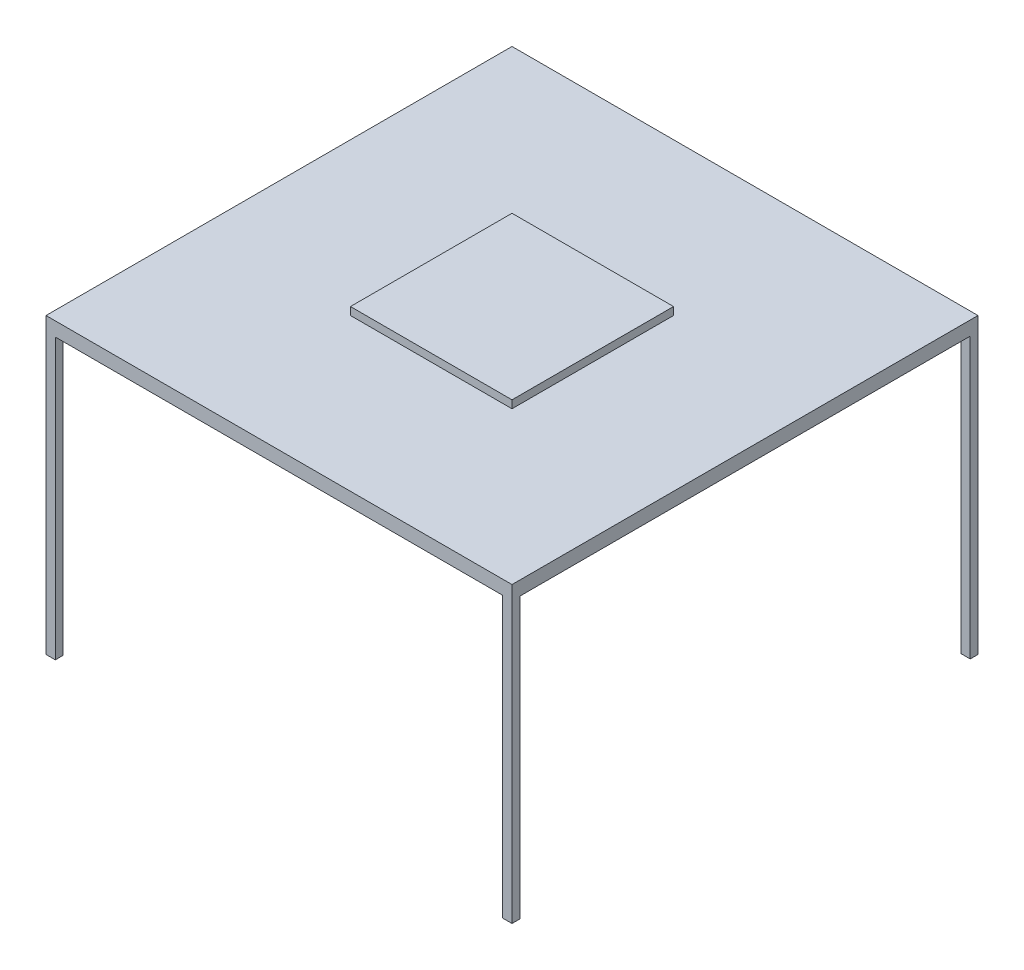
ISO-10303-21;
HEADER;
FILE_DESCRIPTION(('STEP AP214'),'2;1');
FILE_NAME('part.step','',(''),(''),'','','');
FILE_SCHEMA(('AUTOMOTIVE_DESIGN { 1 0 10303 214 1 1 1 1 }'));
ENDSEC;
DATA;
#1=APPLICATION_CONTEXT('core data for automotive mechanical design processes');
#2=APPLICATION_PROTOCOL_DEFINITION('international standard','automotive_design',2000,#1);
#3=PRODUCT_CONTEXT('',#1,'mechanical');
#4=PRODUCT('Part','Part','',(#3));
#5=PRODUCT_RELATED_PRODUCT_CATEGORY('part','',(#4));
#6=PRODUCT_DEFINITION_FORMATION('','',#4);
#7=PRODUCT_DEFINITION_CONTEXT('part definition',#1,'design');
#8=PRODUCT_DEFINITION('design','',#6,#7);
#9=PRODUCT_DEFINITION_SHAPE('','',#8);
#10=(LENGTH_UNIT() NAMED_UNIT(*) SI_UNIT(.MILLI.,.METRE.));
#11=(NAMED_UNIT(*) PLANE_ANGLE_UNIT() SI_UNIT($,.RADIAN.));
#12=(NAMED_UNIT(*) SI_UNIT($,.STERADIAN.) SOLID_ANGLE_UNIT());
#13=UNCERTAINTY_MEASURE_WITH_UNIT(LENGTH_MEASURE(1.E-05),#10,'distance_accuracy_value','');
#14=(GEOMETRIC_REPRESENTATION_CONTEXT(3) GLOBAL_UNCERTAINTY_ASSIGNED_CONTEXT((#13)) GLOBAL_UNIT_ASSIGNED_CONTEXT((#10,
#11,#12)) REPRESENTATION_CONTEXT('',''));
#15=CARTESIAN_POINT('',(0.,0.,0.));
#16=DIRECTION('',(0.,0.,1.));
#17=DIRECTION('',(1.,0.,0.));
#18=AXIS2_PLACEMENT_3D('',#15,#16,#17);
#19=CARTESIAN_POINT('',(0.,-45.,0.));
#20=DIRECTION('',(0.,1.,0.));
#21=DIRECTION('',(0.,0.,1.));
#22=AXIS2_PLACEMENT_3D('',#19,#20,#21);
#23=PLANE('',#22);
#24=DIRECTION('',(0.,0.,1.));
#25=VECTOR('',#24,1.);
#26=CARTESIAN_POINT('',(-725.,-45.,-720.));
#27=LINE('',#26,#25);
#28=CARTESIAN_POINT('',(-725.,-45.,-750.));
#29=VERTEX_POINT('',#28);
#30=CARTESIAN_POINT('',(-725.,-45.,-720.));
#31=VERTEX_POINT('',#30);
#32=EDGE_CURVE('E196',#29,#31,#27,.T.);
#33=ORIENTED_EDGE('',*,*,#32,.F.);
#34=DIRECTION('',(1.,0.,0.));
#35=VECTOR('',#34,1.);
#36=CARTESIAN_POINT('',(750.,-45.,-750.));
#37=LINE('',#36,#35);
#38=CARTESIAN_POINT('',(720.,-45.,-750.));
#39=VERTEX_POINT('',#38);
#40=EDGE_CURVE('E278',#29,#39,#37,.T.);
#41=ORIENTED_EDGE('',*,*,#40,.T.);
#42=DIRECTION('',(0.,0.,-1.));
#43=VECTOR('',#42,1.);
#44=CARTESIAN_POINT('',(720.,-45.,-750.));
#45=LINE('',#44,#43);
#46=CARTESIAN_POINT('',(720.,-45.,-725.));
#47=VERTEX_POINT('',#46);
#48=EDGE_CURVE('E200',#47,#39,#45,.T.);
#49=ORIENTED_EDGE('',*,*,#48,.F.);
#50=DIRECTION('',(-1.,0.,0.));
#51=VECTOR('',#50,1.);
#52=CARTESIAN_POINT('',(720.,-45.,-725.));
#53=LINE('',#52,#51);
#54=CARTESIAN_POINT('',(750.,-45.,-725.));
#55=VERTEX_POINT('',#54);
#56=EDGE_CURVE('E197',#55,#47,#53,.T.);
#57=ORIENTED_EDGE('',*,*,#56,.F.);
#58=DIRECTION('',(0.,0.,1.));
#59=VECTOR('',#58,1.);
#60=CARTESIAN_POINT('',(750.,-45.,750.));
#61=LINE('',#60,#59);
#62=CARTESIAN_POINT('',(750.,-45.,725.));
#63=VERTEX_POINT('',#62);
#64=EDGE_CURVE('E281',#55,#63,#61,.T.);
#65=ORIENTED_EDGE('',*,*,#64,.T.);
#66=DIRECTION('',(1.,0.,0.));
#67=VECTOR('',#66,1.);
#68=CARTESIAN_POINT('',(720.,-45.,725.));
#69=LINE('',#68,#67);
#70=CARTESIAN_POINT('',(720.,-45.,725.));
#71=VERTEX_POINT('',#70);
#72=EDGE_CURVE('E257',#71,#63,#69,.T.);
#73=ORIENTED_EDGE('',*,*,#72,.F.);
#74=DIRECTION('',(0.,0.,-1.));
#75=VECTOR('',#74,1.);
#76=CARTESIAN_POINT('',(720.,-45.,750.));
#77=LINE('',#76,#75);
#78=CARTESIAN_POINT('',(720.,-45.,750.));
#79=VERTEX_POINT('',#78);
#80=EDGE_CURVE('E252',#79,#71,#77,.T.);
#81=ORIENTED_EDGE('',*,*,#80,.F.);
#82=DIRECTION('',(-1.,0.,0.));
#83=VECTOR('',#82,1.);
#84=CARTESIAN_POINT('',(750.,-45.,750.));
#85=LINE('',#84,#83);
#86=CARTESIAN_POINT('',(-720.,-45.,750.));
#87=VERTEX_POINT('',#86);
#88=EDGE_CURVE('E283',#79,#87,#85,.T.);
#89=ORIENTED_EDGE('',*,*,#88,.T.);
#90=DIRECTION('',(0.,0.,1.));
#91=VECTOR('',#90,1.);
#92=CARTESIAN_POINT('',(-720.,-45.,750.));
#93=LINE('',#92,#91);
#94=CARTESIAN_POINT('',(-720.,-45.,725.));
#95=VERTEX_POINT('',#94);
#96=EDGE_CURVE('E232',#95,#87,#93,.T.);
#97=ORIENTED_EDGE('',*,*,#96,.F.);
#98=DIRECTION('',(1.,0.,0.));
#99=VECTOR('',#98,1.);
#100=CARTESIAN_POINT('',(-720.,-45.,725.));
#101=LINE('',#100,#99);
#102=CARTESIAN_POINT('',(-750.,-45.,725.));
#103=VERTEX_POINT('',#102);
#104=EDGE_CURVE('E227',#103,#95,#101,.T.);
#105=ORIENTED_EDGE('',*,*,#104,.F.);
#106=DIRECTION('',(0.,0.,-1.));
#107=VECTOR('',#106,1.);
#108=CARTESIAN_POINT('',(-750.,-45.,750.));
#109=LINE('',#108,#107);
#110=CARTESIAN_POINT('',(-750.,-45.,-720.));
#111=VERTEX_POINT('',#110);
#112=EDGE_CURVE('E58',#103,#111,#109,.T.);
#113=ORIENTED_EDGE('',*,*,#112,.T.);
#114=DIRECTION('',(-1.,0.,0.));
#115=VECTOR('',#114,1.);
#116=CARTESIAN_POINT('',(-750.,-45.,-720.));
#117=LINE('',#116,#115);
#118=EDGE_CURVE('E53',#31,#111,#117,.T.);
#119=ORIENTED_EDGE('',*,*,#118,.F.);
#120=EDGE_LOOP('',(#33,#41,#49,#57,#65,#73,#81,#89,#97,#105,#113,#119));
#121=FACE_BOUND('',#120,.T.);
#122=ADVANCED_FACE('F38',(#121),#23,.F.);
#123=CARTESIAN_POINT('',(0.,25.,260.));
#124=DIRECTION('',(0.,0.,-1.));
#125=DIRECTION('',(-1.,0.,0.));
#126=AXIS2_PLACEMENT_3D('',#123,#124,#125);
#127=PLANE('',#126);
#128=DIRECTION('',(1.,0.,0.));
#129=VECTOR('',#128,1.);
#130=CARTESIAN_POINT('',(0.,0.,260.));
#131=LINE('',#130,#129);
#132=CARTESIAN_POINT('',(-260.,0.,260.));
#133=VERTEX_POINT('',#132);
#134=CARTESIAN_POINT('',(260.,0.,260.));
#135=VERTEX_POINT('',#134);
#136=EDGE_CURVE('E304',#133,#135,#131,.T.);
#137=ORIENTED_EDGE('',*,*,#136,.T.);
#138=DIRECTION('',(0.,-1.,0.));
#139=VECTOR('',#138,1.);
#140=CARTESIAN_POINT('',(260.,25.,260.));
#141=LINE('',#140,#139);
#142=CARTESIAN_POINT('',(260.,25.,260.));
#143=VERTEX_POINT('',#142);
#144=EDGE_CURVE('E11',#143,#135,#141,.T.);
#145=ORIENTED_EDGE('',*,*,#144,.F.);
#146=DIRECTION('',(1.,0.,0.));
#147=VECTOR('',#146,1.);
#148=CARTESIAN_POINT('',(0.,25.,260.));
#149=LINE('',#148,#147);
#150=CARTESIAN_POINT('',(-260.,25.,260.));
#151=VERTEX_POINT('',#150);
#152=EDGE_CURVE('E305',#151,#143,#149,.T.);
#153=ORIENTED_EDGE('',*,*,#152,.F.);
#154=DIRECTION('',(0.,-1.,0.));
#155=VECTOR('',#154,1.);
#156=CARTESIAN_POINT('',(-260.,25.,260.));
#157=LINE('',#156,#155);
#158=EDGE_CURVE('E317',#151,#133,#157,.T.);
#159=ORIENTED_EDGE('',*,*,#158,.T.);
#160=EDGE_LOOP('',(#137,#145,#153,#159));
#161=FACE_BOUND('',#160,.T.);
#162=ADVANCED_FACE('F40',(#161),#127,.F.);
#163=CARTESIAN_POINT('',(260.,25.,0.));
#164=DIRECTION('',(-1.,0.,0.));
#165=DIRECTION('',(0.,0.,1.));
#166=AXIS2_PLACEMENT_3D('',#163,#164,#165);
#167=PLANE('',#166);
#168=DIRECTION('',(0.,0.,-1.));
#169=VECTOR('',#168,1.);
#170=CARTESIAN_POINT('',(260.,0.,0.));
#171=LINE('',#170,#169);
#172=CARTESIAN_POINT('',(260.,0.,-260.));
#173=VERTEX_POINT('',#172);
#174=EDGE_CURVE('E320',#135,#173,#171,.T.);
#175=ORIENTED_EDGE('',*,*,#174,.T.);
#176=DIRECTION('',(0.,-1.,0.));
#177=VECTOR('',#176,1.);
#178=CARTESIAN_POINT('',(260.,25.,-260.));
#179=LINE('',#178,#177);
#180=CARTESIAN_POINT('',(260.,25.,-260.));
#181=VERTEX_POINT('',#180);
#182=EDGE_CURVE('E46',#181,#173,#179,.T.);
#183=ORIENTED_EDGE('',*,*,#182,.F.);
#184=DIRECTION('',(0.,0.,-1.));
#185=VECTOR('',#184,1.);
#186=CARTESIAN_POINT('',(260.,25.,0.));
#187=LINE('',#186,#185);
#188=EDGE_CURVE('E308',#143,#181,#187,.T.);
#189=ORIENTED_EDGE('',*,*,#188,.F.);
#190=ORIENTED_EDGE('',*,*,#144,.T.);
#191=EDGE_LOOP('',(#175,#183,#189,#190));
#192=FACE_BOUND('',#191,.T.);
#193=ADVANCED_FACE('F337',(#192),#167,.F.);
#194=CARTESIAN_POINT('',(0.,25.,-260.));
#195=DIRECTION('',(0.,0.,-1.));
#196=DIRECTION('',(-1.,0.,0.));
#197=AXIS2_PLACEMENT_3D('',#194,#195,#196);
#198=PLANE('',#197);
#199=DIRECTION('',(1.,0.,0.));
#200=VECTOR('',#199,1.);
#201=CARTESIAN_POINT('',(0.,0.,-260.));
#202=LINE('',#201,#200);
#203=CARTESIAN_POINT('',(-260.,0.,-260.));
#204=VERTEX_POINT('',#203);
#205=EDGE_CURVE('E323',#204,#173,#202,.T.);
#206=ORIENTED_EDGE('',*,*,#205,.F.);
#207=DIRECTION('',(0.,-1.,0.));
#208=VECTOR('',#207,1.);
#209=CARTESIAN_POINT('',(-260.,25.,-260.));
#210=LINE('',#209,#208);
#211=CARTESIAN_POINT('',(-260.,25.,-260.));
#212=VERTEX_POINT('',#211);
#213=EDGE_CURVE('E328',#212,#204,#210,.T.);
#214=ORIENTED_EDGE('',*,*,#213,.F.);
#215=DIRECTION('',(1.,0.,0.));
#216=VECTOR('',#215,1.);
#217=CARTESIAN_POINT('',(0.,25.,-260.));
#218=LINE('',#217,#216);
#219=EDGE_CURVE('E311',#212,#181,#218,.T.);
#220=ORIENTED_EDGE('',*,*,#219,.T.);
#221=ORIENTED_EDGE('',*,*,#182,.T.);
#222=EDGE_LOOP('',(#206,#214,#220,#221));
#223=FACE_BOUND('',#222,.T.);
#224=ADVANCED_FACE('F334',(#223),#198,.T.);
#225=CARTESIAN_POINT('',(-260.,25.,0.));
#226=DIRECTION('',(-1.,0.,0.));
#227=DIRECTION('',(0.,0.,1.));
#228=AXIS2_PLACEMENT_3D('',#225,#226,#227);
#229=PLANE('',#228);
#230=DIRECTION('',(0.,0.,-1.));
#231=VECTOR('',#230,1.);
#232=CARTESIAN_POINT('',(-260.,0.,0.));
#233=LINE('',#232,#231);
#234=EDGE_CURVE('E309',#133,#204,#233,.T.);
#235=ORIENTED_EDGE('',*,*,#234,.F.);
#236=ORIENTED_EDGE('',*,*,#158,.F.);
#237=DIRECTION('',(0.,0.,-1.));
#238=VECTOR('',#237,1.);
#239=CARTESIAN_POINT('',(-260.,25.,0.));
#240=LINE('',#239,#238);
#241=EDGE_CURVE('E314',#151,#212,#240,.T.);
#242=ORIENTED_EDGE('',*,*,#241,.T.);
#243=ORIENTED_EDGE('',*,*,#213,.T.);
#244=EDGE_LOOP('',(#235,#236,#242,#243));
#245=FACE_BOUND('',#244,.T.);
#246=ADVANCED_FACE('F343',(#245),#229,.T.);
#247=CARTESIAN_POINT('',(0.,25.,0.));
#248=DIRECTION('',(0.,1.,0.));
#249=DIRECTION('',(0.,0.,1.));
#250=AXIS2_PLACEMENT_3D('',#247,#248,#249);
#251=PLANE('',#250);
#252=ORIENTED_EDGE('',*,*,#152,.T.);
#253=ORIENTED_EDGE('',*,*,#188,.T.);
#254=ORIENTED_EDGE('',*,*,#219,.F.);
#255=ORIENTED_EDGE('',*,*,#241,.F.);
#256=EDGE_LOOP('',(#252,#253,#254,#255));
#257=FACE_BOUND('',#256,.T.);
#258=ADVANCED_FACE('F346',(#257),#251,.T.);
#259=CARTESIAN_POINT('',(0.,0.,0.));
#260=DIRECTION('',(0.,1.,0.));
#261=DIRECTION('',(0.,0.,1.));
#262=AXIS2_PLACEMENT_3D('',#259,#260,#261);
#263=PLANE('',#262);
#264=DIRECTION('',(0.,0.,-1.));
#265=VECTOR('',#264,1.);
#266=CARTESIAN_POINT('',(-750.,0.,750.));
#267=LINE('',#266,#265);
#268=CARTESIAN_POINT('',(-750.,0.,750.));
#269=VERTEX_POINT('',#268);
#270=CARTESIAN_POINT('',(-750.,0.,-750.));
#271=VERTEX_POINT('',#270);
#272=EDGE_CURVE('E276',#269,#271,#267,.T.);
#273=ORIENTED_EDGE('',*,*,#272,.F.);
#274=DIRECTION('',(-1.,0.,0.));
#275=VECTOR('',#274,1.);
#276=CARTESIAN_POINT('',(750.,0.,750.));
#277=LINE('',#276,#275);
#278=CARTESIAN_POINT('',(750.,0.,750.));
#279=VERTEX_POINT('',#278);
#280=EDGE_CURVE('E279',#279,#269,#277,.T.);
#281=ORIENTED_EDGE('',*,*,#280,.F.);
#282=DIRECTION('',(0.,0.,1.));
#283=VECTOR('',#282,1.);
#284=CARTESIAN_POINT('',(750.,0.,750.));
#285=LINE('',#284,#283);
#286=CARTESIAN_POINT('',(750.,0.,-750.));
#287=VERTEX_POINT('',#286);
#288=EDGE_CURVE('E290',#287,#279,#285,.T.);
#289=ORIENTED_EDGE('',*,*,#288,.F.);
#290=DIRECTION('',(1.,0.,0.));
#291=VECTOR('',#290,1.);
#292=CARTESIAN_POINT('',(750.,0.,-750.));
#293=LINE('',#292,#291);
#294=EDGE_CURVE('E288',#271,#287,#293,.T.);
#295=ORIENTED_EDGE('',*,*,#294,.F.);
#296=EDGE_LOOP('',(#273,#281,#289,#295));
#297=FACE_BOUND('',#296,.T.);
#298=ORIENTED_EDGE('',*,*,#136,.F.);
#299=ORIENTED_EDGE('',*,*,#234,.T.);
#300=ORIENTED_EDGE('',*,*,#205,.T.);
#301=ORIENTED_EDGE('',*,*,#174,.F.);
#302=EDGE_LOOP('',(#298,#299,#300,#301));
#303=FACE_BOUND('',#302,.T.);
#304=ADVANCED_FACE('F340',(#297,#303),#263,.T.);
#305=CARTESIAN_POINT('',(-750.,-45.,750.));
#306=DIRECTION('',(1.,0.,0.));
#307=DIRECTION('',(0.,0.,-1.));
#308=AXIS2_PLACEMENT_3D('',#305,#306,#307);
#309=PLANE('',#308);
#310=ORIENTED_EDGE('',*,*,#272,.T.);
#311=DIRECTION('',(0.,1.,0.));
#312=VECTOR('',#311,1.);
#313=CARTESIAN_POINT('',(-750.,-45.,-750.));
#314=LINE('',#313,#312);
#315=CARTESIAN_POINT('',(-750.,-945.,-750.));
#316=VERTEX_POINT('',#315);
#317=EDGE_CURVE('E301',#316,#271,#314,.T.);
#318=ORIENTED_EDGE('',*,*,#317,.F.);
#319=DIRECTION('',(0.,0.,-1.));
#320=VECTOR('',#319,1.);
#321=CARTESIAN_POINT('',(-750.,-945.,-750.));
#322=LINE('',#321,#320);
#323=CARTESIAN_POINT('',(-750.,-945.,-720.));
#324=VERTEX_POINT('',#323);
#325=EDGE_CURVE('E184',#324,#316,#322,.T.);
#326=ORIENTED_EDGE('',*,*,#325,.F.);
#327=DIRECTION('',(0.,1.,0.));
#328=VECTOR('',#327,1.);
#329=CARTESIAN_POINT('',(-750.,-945.,-720.));
#330=LINE('',#329,#328);
#331=EDGE_CURVE('E180',#324,#111,#330,.T.);
#332=ORIENTED_EDGE('',*,*,#331,.T.);
#333=ORIENTED_EDGE('',*,*,#112,.F.);
#334=DIRECTION('',(0.,1.,0.));
#335=VECTOR('',#334,1.);
#336=CARTESIAN_POINT('',(-750.,-945.,725.));
#337=LINE('',#336,#335);
#338=CARTESIAN_POINT('',(-750.,-945.,725.));
#339=VERTEX_POINT('',#338);
#340=EDGE_CURVE('E239',#339,#103,#337,.T.);
#341=ORIENTED_EDGE('',*,*,#340,.F.);
#342=DIRECTION('',(0.,0.,-1.));
#343=VECTOR('',#342,1.);
#344=CARTESIAN_POINT('',(-750.,-945.,725.));
#345=LINE('',#344,#343);
#346=CARTESIAN_POINT('',(-750.,-945.,750.));
#347=VERTEX_POINT('',#346);
#348=EDGE_CURVE('E237',#347,#339,#345,.T.);
#349=ORIENTED_EDGE('',*,*,#348,.F.);
#350=DIRECTION('',(0.,1.,0.));
#351=VECTOR('',#350,1.);
#352=CARTESIAN_POINT('',(-750.,-45.,750.));
#353=LINE('',#352,#351);
#354=EDGE_CURVE('E285',#347,#269,#353,.T.);
#355=ORIENTED_EDGE('',*,*,#354,.T.);
#356=EDGE_LOOP('',(#310,#318,#326,#332,#333,#341,#349,#355));
#357=FACE_BOUND('',#356,.T.);
#358=ADVANCED_FACE('F363',(#357),#309,.F.);
#359=CARTESIAN_POINT('',(750.,-45.,-750.));
#360=DIRECTION('',(0.,0.,1.));
#361=DIRECTION('',(1.,0.,0.));
#362=AXIS2_PLACEMENT_3D('',#359,#360,#361);
#363=PLANE('',#362);
#364=ORIENTED_EDGE('',*,*,#294,.T.);
#365=DIRECTION('',(0.,1.,0.));
#366=VECTOR('',#365,1.);
#367=CARTESIAN_POINT('',(750.,-45.,-750.));
#368=LINE('',#367,#366);
#369=CARTESIAN_POINT('',(750.,-945.,-750.));
#370=VERTEX_POINT('',#369);
#371=EDGE_CURVE('E298',#370,#287,#368,.T.);
#372=ORIENTED_EDGE('',*,*,#371,.F.);
#373=DIRECTION('',(1.,0.,0.));
#374=VECTOR('',#373,1.);
#375=CARTESIAN_POINT('',(750.,-945.,-750.));
#376=LINE('',#375,#374);
#377=CARTESIAN_POINT('',(720.,-945.,-750.));
#378=VERTEX_POINT('',#377);
#379=EDGE_CURVE('E213',#378,#370,#376,.T.);
#380=ORIENTED_EDGE('',*,*,#379,.F.);
#381=DIRECTION('',(0.,1.,0.));
#382=VECTOR('',#381,1.);
#383=CARTESIAN_POINT('',(720.,-945.,-750.));
#384=LINE('',#383,#382);
#385=EDGE_CURVE('E215',#378,#39,#384,.T.);
#386=ORIENTED_EDGE('',*,*,#385,.T.);
#387=ORIENTED_EDGE('',*,*,#40,.F.);
#388=DIRECTION('',(0.,1.,0.));
#389=VECTOR('',#388,1.);
#390=CARTESIAN_POINT('',(-725.,-945.,-750.));
#391=LINE('',#390,#389);
#392=CARTESIAN_POINT('',(-725.,-945.,-750.));
#393=VERTEX_POINT('',#392);
#394=EDGE_CURVE('E202',#393,#29,#391,.T.);
#395=ORIENTED_EDGE('',*,*,#394,.F.);
#396=DIRECTION('',(1.,0.,0.));
#397=VECTOR('',#396,1.);
#398=CARTESIAN_POINT('',(-725.,-945.,-750.));
#399=LINE('',#398,#397);
#400=EDGE_CURVE('E190',#316,#393,#399,.T.);
#401=ORIENTED_EDGE('',*,*,#400,.F.);
#402=ORIENTED_EDGE('',*,*,#317,.T.);
#403=EDGE_LOOP('',(#364,#372,#380,#386,#387,#395,#401,#402));
#404=FACE_BOUND('',#403,.T.);
#405=ADVANCED_FACE('F372',(#404),#363,.F.);
#406=CARTESIAN_POINT('',(750.,-45.,750.));
#407=DIRECTION('',(-1.,0.,0.));
#408=DIRECTION('',(0.,0.,1.));
#409=AXIS2_PLACEMENT_3D('',#406,#407,#408);
#410=PLANE('',#409);
#411=ORIENTED_EDGE('',*,*,#288,.T.);
#412=DIRECTION('',(0.,1.,0.));
#413=VECTOR('',#412,1.);
#414=CARTESIAN_POINT('',(750.,-45.,750.));
#415=LINE('',#414,#413);
#416=CARTESIAN_POINT('',(750.,-945.,750.));
#417=VERTEX_POINT('',#416);
#418=EDGE_CURVE('E295',#417,#279,#415,.T.);
#419=ORIENTED_EDGE('',*,*,#418,.F.);
#420=DIRECTION('',(0.,0.,1.));
#421=VECTOR('',#420,1.);
#422=CARTESIAN_POINT('',(750.,-945.,725.));
#423=LINE('',#422,#421);
#424=CARTESIAN_POINT('',(750.,-945.,725.));
#425=VERTEX_POINT('',#424);
#426=EDGE_CURVE('E253',#425,#417,#423,.T.);
#427=ORIENTED_EDGE('',*,*,#426,.F.);
#428=DIRECTION('',(0.,1.,0.));
#429=VECTOR('',#428,1.);
#430=CARTESIAN_POINT('',(750.,-945.,725.));
#431=LINE('',#430,#429);
#432=EDGE_CURVE('E263',#425,#63,#431,.T.);
#433=ORIENTED_EDGE('',*,*,#432,.T.);
#434=ORIENTED_EDGE('',*,*,#64,.F.);
#435=DIRECTION('',(0.,1.,0.));
#436=VECTOR('',#435,1.);
#437=CARTESIAN_POINT('',(750.,-945.,-725.));
#438=LINE('',#437,#436);
#439=CARTESIAN_POINT('',(750.,-945.,-725.));
#440=VERTEX_POINT('',#439);
#441=EDGE_CURVE('E224',#440,#55,#438,.T.);
#442=ORIENTED_EDGE('',*,*,#441,.F.);
#443=DIRECTION('',(0.,0.,1.));
#444=VECTOR('',#443,1.);
#445=CARTESIAN_POINT('',(750.,-945.,-725.));
#446=LINE('',#445,#444);
#447=EDGE_CURVE('E206',#370,#440,#446,.T.);
#448=ORIENTED_EDGE('',*,*,#447,.F.);
#449=ORIENTED_EDGE('',*,*,#371,.T.);
#450=EDGE_LOOP('',(#411,#419,#427,#433,#434,#442,#448,#449));
#451=FACE_BOUND('',#450,.T.);
#452=ADVANCED_FACE('F368',(#451),#410,.F.);
#453=CARTESIAN_POINT('',(750.,-45.,750.));
#454=DIRECTION('',(0.,0.,-1.));
#455=DIRECTION('',(-1.,0.,0.));
#456=AXIS2_PLACEMENT_3D('',#453,#454,#455);
#457=PLANE('',#456);
#458=ORIENTED_EDGE('',*,*,#280,.T.);
#459=ORIENTED_EDGE('',*,*,#354,.F.);
#460=DIRECTION('',(-1.,0.,0.));
#461=VECTOR('',#460,1.);
#462=CARTESIAN_POINT('',(-750.,-945.,750.));
#463=LINE('',#462,#461);
#464=CARTESIAN_POINT('',(-720.,-945.,750.));
#465=VERTEX_POINT('',#464);
#466=EDGE_CURVE('E234',#465,#347,#463,.T.);
#467=ORIENTED_EDGE('',*,*,#466,.F.);
#468=DIRECTION('',(0.,1.,0.));
#469=VECTOR('',#468,1.);
#470=CARTESIAN_POINT('',(-720.,-945.,750.));
#471=LINE('',#470,#469);
#472=EDGE_CURVE('E246',#465,#87,#471,.T.);
#473=ORIENTED_EDGE('',*,*,#472,.T.);
#474=ORIENTED_EDGE('',*,*,#88,.F.);
#475=DIRECTION('',(0.,1.,0.));
#476=VECTOR('',#475,1.);
#477=CARTESIAN_POINT('',(720.,-945.,750.));
#478=LINE('',#477,#476);
#479=CARTESIAN_POINT('',(720.,-945.,750.));
#480=VERTEX_POINT('',#479);
#481=EDGE_CURVE('E273',#480,#79,#478,.T.);
#482=ORIENTED_EDGE('',*,*,#481,.F.);
#483=DIRECTION('',(-1.,0.,0.));
#484=VECTOR('',#483,1.);
#485=CARTESIAN_POINT('',(750.,-945.,750.));
#486=LINE('',#485,#484);
#487=EDGE_CURVE('E256',#417,#480,#486,.T.);
#488=ORIENTED_EDGE('',*,*,#487,.F.);
#489=ORIENTED_EDGE('',*,*,#418,.T.);
#490=EDGE_LOOP('',(#458,#459,#467,#473,#474,#482,#488,#489));
#491=FACE_BOUND('',#490,.T.);
#492=ADVANCED_FACE('F365',(#491),#457,.F.);
#493=CARTESIAN_POINT('',(720.,-945.,750.));
#494=DIRECTION('',(1.,0.,0.));
#495=DIRECTION('',(0.,0.,-1.));
#496=AXIS2_PLACEMENT_3D('',#493,#494,#495);
#497=PLANE('',#496);
#498=ORIENTED_EDGE('',*,*,#80,.T.);
#499=DIRECTION('',(0.,1.,0.));
#500=VECTOR('',#499,1.);
#501=CARTESIAN_POINT('',(720.,-945.,725.));
#502=LINE('',#501,#500);
#503=CARTESIAN_POINT('',(720.,-945.,725.));
#504=VERTEX_POINT('',#503);
#505=EDGE_CURVE('E270',#504,#71,#502,.T.);
#506=ORIENTED_EDGE('',*,*,#505,.F.);
#507=DIRECTION('',(0.,0.,-1.));
#508=VECTOR('',#507,1.);
#509=CARTESIAN_POINT('',(720.,-945.,750.));
#510=LINE('',#509,#508);
#511=EDGE_CURVE('E259',#480,#504,#510,.T.);
#512=ORIENTED_EDGE('',*,*,#511,.F.);
#513=ORIENTED_EDGE('',*,*,#481,.T.);
#514=EDGE_LOOP('',(#498,#506,#512,#513));
#515=FACE_BOUND('',#514,.T.);
#516=ADVANCED_FACE('F359',(#515),#497,.F.);
#517=CARTESIAN_POINT('',(720.,-945.,725.));
#518=DIRECTION('',(0.,0.,1.));
#519=DIRECTION('',(1.,0.,0.));
#520=AXIS2_PLACEMENT_3D('',#517,#518,#519);
#521=PLANE('',#520);
#522=ORIENTED_EDGE('',*,*,#72,.T.);
#523=ORIENTED_EDGE('',*,*,#432,.F.);
#524=DIRECTION('',(1.,0.,0.));
#525=VECTOR('',#524,1.);
#526=CARTESIAN_POINT('',(720.,-945.,725.));
#527=LINE('',#526,#525);
#528=EDGE_CURVE('E261',#504,#425,#527,.T.);
#529=ORIENTED_EDGE('',*,*,#528,.F.);
#530=ORIENTED_EDGE('',*,*,#505,.T.);
#531=EDGE_LOOP('',(#522,#523,#529,#530));
#532=FACE_BOUND('',#531,.T.);
#533=ADVANCED_FACE('F428',(#532),#521,.F.);
#534=CARTESIAN_POINT('',(0.,-945.,0.));
#535=DIRECTION('',(0.,-1.,0.));
#536=DIRECTION('',(0.,0.,-1.));
#537=AXIS2_PLACEMENT_3D('',#534,#535,#536);
#538=PLANE('',#537);
#539=ORIENTED_EDGE('',*,*,#426,.T.);
#540=ORIENTED_EDGE('',*,*,#487,.T.);
#541=ORIENTED_EDGE('',*,*,#511,.T.);
#542=ORIENTED_EDGE('',*,*,#528,.T.);
#543=EDGE_LOOP('',(#539,#540,#541,#542));
#544=FACE_BOUND('',#543,.T.);
#545=ADVANCED_FACE('F435',(#544),#538,.T.);
#546=CARTESIAN_POINT('',(-720.,-945.,725.));
#547=DIRECTION('',(0.,0.,1.));
#548=DIRECTION('',(1.,0.,0.));
#549=AXIS2_PLACEMENT_3D('',#546,#547,#548);
#550=PLANE('',#549);
#551=ORIENTED_EDGE('',*,*,#104,.T.);
#552=DIRECTION('',(0.,1.,0.));
#553=VECTOR('',#552,1.);
#554=CARTESIAN_POINT('',(-720.,-945.,725.));
#555=LINE('',#554,#553);
#556=CARTESIAN_POINT('',(-720.,-945.,725.));
#557=VERTEX_POINT('',#556);
#558=EDGE_CURVE('E249',#557,#95,#555,.T.);
#559=ORIENTED_EDGE('',*,*,#558,.F.);
#560=DIRECTION('',(1.,0.,0.));
#561=VECTOR('',#560,1.);
#562=CARTESIAN_POINT('',(-720.,-945.,725.));
#563=LINE('',#562,#561);
#564=EDGE_CURVE('E228',#339,#557,#563,.T.);
#565=ORIENTED_EDGE('',*,*,#564,.F.);
#566=ORIENTED_EDGE('',*,*,#340,.T.);
#567=EDGE_LOOP('',(#551,#559,#565,#566));
#568=FACE_BOUND('',#567,.T.);
#569=ADVANCED_FACE('F441',(#568),#550,.F.);
#570=CARTESIAN_POINT('',(-720.,-945.,750.));
#571=DIRECTION('',(-1.,0.,0.));
#572=DIRECTION('',(0.,0.,1.));
#573=AXIS2_PLACEMENT_3D('',#570,#571,#572);
#574=PLANE('',#573);
#575=ORIENTED_EDGE('',*,*,#96,.T.);
#576=ORIENTED_EDGE('',*,*,#472,.F.);
#577=DIRECTION('',(0.,0.,1.));
#578=VECTOR('',#577,1.);
#579=CARTESIAN_POINT('',(-720.,-945.,750.));
#580=LINE('',#579,#578);
#581=EDGE_CURVE('E231',#557,#465,#580,.T.);
#582=ORIENTED_EDGE('',*,*,#581,.F.);
#583=ORIENTED_EDGE('',*,*,#558,.T.);
#584=EDGE_LOOP('',(#575,#576,#582,#583));
#585=FACE_BOUND('',#584,.T.);
#586=ADVANCED_FACE('F448',(#585),#574,.F.);
#587=CARTESIAN_POINT('',(0.,-945.,0.));
#588=DIRECTION('',(0.,1.,0.));
#589=DIRECTION('',(0.,0.,1.));
#590=AXIS2_PLACEMENT_3D('',#587,#588,#589);
#591=PLANE('',#590);
#592=ORIENTED_EDGE('',*,*,#564,.T.);
#593=ORIENTED_EDGE('',*,*,#581,.T.);
#594=ORIENTED_EDGE('',*,*,#466,.T.);
#595=ORIENTED_EDGE('',*,*,#348,.T.);
#596=EDGE_LOOP('',(#592,#593,#594,#595));
#597=FACE_BOUND('',#596,.T.);
#598=ADVANCED_FACE('F456',(#597),#591,.F.);
#599=CARTESIAN_POINT('',(720.,-945.,-725.));
#600=DIRECTION('',(0.,0.,-1.));
#601=DIRECTION('',(-1.,0.,0.));
#602=AXIS2_PLACEMENT_3D('',#599,#600,#601);
#603=PLANE('',#602);
#604=ORIENTED_EDGE('',*,*,#56,.T.);
#605=DIRECTION('',(0.,1.,0.));
#606=VECTOR('',#605,1.);
#607=CARTESIAN_POINT('',(720.,-945.,-725.));
#608=LINE('',#607,#606);
#609=CARTESIAN_POINT('',(720.,-945.,-725.));
#610=VERTEX_POINT('',#609);
#611=EDGE_CURVE('E221',#610,#47,#608,.T.);
#612=ORIENTED_EDGE('',*,*,#611,.F.);
#613=DIRECTION('',(-1.,0.,0.));
#614=VECTOR('',#613,1.);
#615=CARTESIAN_POINT('',(720.,-945.,-725.));
#616=LINE('',#615,#614);
#617=EDGE_CURVE('E209',#440,#610,#616,.T.);
#618=ORIENTED_EDGE('',*,*,#617,.F.);
#619=ORIENTED_EDGE('',*,*,#441,.T.);
#620=EDGE_LOOP('',(#604,#612,#618,#619));
#621=FACE_BOUND('',#620,.T.);
#622=ADVANCED_FACE('F463',(#621),#603,.F.);
#623=CARTESIAN_POINT('',(720.,-945.,-750.));
#624=DIRECTION('',(1.,0.,0.));
#625=DIRECTION('',(0.,0.,-1.));
#626=AXIS2_PLACEMENT_3D('',#623,#624,#625);
#627=PLANE('',#626);
#628=ORIENTED_EDGE('',*,*,#48,.T.);
#629=ORIENTED_EDGE('',*,*,#385,.F.);
#630=DIRECTION('',(0.,0.,-1.));
#631=VECTOR('',#630,1.);
#632=CARTESIAN_POINT('',(720.,-945.,-750.));
#633=LINE('',#632,#631);
#634=EDGE_CURVE('E211',#610,#378,#633,.T.);
#635=ORIENTED_EDGE('',*,*,#634,.F.);
#636=ORIENTED_EDGE('',*,*,#611,.T.);
#637=EDGE_LOOP('',(#628,#629,#635,#636));
#638=FACE_BOUND('',#637,.T.);
#639=ADVANCED_FACE('F470',(#638),#627,.F.);
#640=CARTESIAN_POINT('',(0.,-945.,0.));
#641=DIRECTION('',(0.,1.,0.));
#642=DIRECTION('',(0.,0.,1.));
#643=AXIS2_PLACEMENT_3D('',#640,#641,#642);
#644=PLANE('',#643);
#645=ORIENTED_EDGE('',*,*,#447,.T.);
#646=ORIENTED_EDGE('',*,*,#617,.T.);
#647=ORIENTED_EDGE('',*,*,#634,.T.);
#648=ORIENTED_EDGE('',*,*,#379,.T.);
#649=EDGE_LOOP('',(#645,#646,#647,#648));
#650=FACE_BOUND('',#649,.T.);
#651=ADVANCED_FACE('F478',(#650),#644,.F.);
#652=CARTESIAN_POINT('',(-725.,-945.,-720.));
#653=DIRECTION('',(-1.,0.,0.));
#654=DIRECTION('',(0.,0.,1.));
#655=AXIS2_PLACEMENT_3D('',#652,#653,#654);
#656=PLANE('',#655);
#657=ORIENTED_EDGE('',*,*,#32,.T.);
#658=DIRECTION('',(0.,1.,0.));
#659=VECTOR('',#658,1.);
#660=CARTESIAN_POINT('',(-725.,-945.,-720.));
#661=LINE('',#660,#659);
#662=CARTESIAN_POINT('',(-725.,-945.,-720.));
#663=VERTEX_POINT('',#662);
#664=EDGE_CURVE('E177',#663,#31,#661,.T.);
#665=ORIENTED_EDGE('',*,*,#664,.F.);
#666=DIRECTION('',(0.,0.,1.));
#667=VECTOR('',#666,1.);
#668=CARTESIAN_POINT('',(-725.,-945.,-720.));
#669=LINE('',#668,#667);
#670=EDGE_CURVE('E185',#393,#663,#669,.T.);
#671=ORIENTED_EDGE('',*,*,#670,.F.);
#672=ORIENTED_EDGE('',*,*,#394,.T.);
#673=EDGE_LOOP('',(#657,#665,#671,#672));
#674=FACE_BOUND('',#673,.T.);
#675=ADVANCED_FACE('F195',(#674),#656,.F.);
#676=CARTESIAN_POINT('',(-750.,-945.,-720.));
#677=DIRECTION('',(0.,0.,-1.));
#678=DIRECTION('',(-1.,0.,0.));
#679=AXIS2_PLACEMENT_3D('',#676,#677,#678);
#680=PLANE('',#679);
#681=ORIENTED_EDGE('',*,*,#118,.T.);
#682=ORIENTED_EDGE('',*,*,#331,.F.);
#683=DIRECTION('',(-1.,0.,0.));
#684=VECTOR('',#683,1.);
#685=CARTESIAN_POINT('',(-750.,-945.,-720.));
#686=LINE('',#685,#684);
#687=EDGE_CURVE('E173',#663,#324,#686,.T.);
#688=ORIENTED_EDGE('',*,*,#687,.F.);
#689=ORIENTED_EDGE('',*,*,#664,.T.);
#690=EDGE_LOOP('',(#681,#682,#688,#689));
#691=FACE_BOUND('',#690,.T.);
#692=ADVANCED_FACE('F175',(#691),#680,.F.);
#693=CARTESIAN_POINT('',(0.,-945.,0.));
#694=DIRECTION('',(0.,1.,0.));
#695=DIRECTION('',(0.,0.,1.));
#696=AXIS2_PLACEMENT_3D('',#693,#694,#695);
#697=PLANE('',#696);
#698=ORIENTED_EDGE('',*,*,#670,.T.);
#699=ORIENTED_EDGE('',*,*,#687,.T.);
#700=ORIENTED_EDGE('',*,*,#325,.T.);
#701=ORIENTED_EDGE('',*,*,#400,.T.);
#702=EDGE_LOOP('',(#698,#699,#700,#701));
#703=FACE_BOUND('',#702,.T.);
#704=ADVANCED_FACE('F188',(#703),#697,.F.);
#705=CLOSED_SHELL('',(#122,#162,#193,#224,#246,#258,#304,#358,#405,#452,#492,#516,#533,#545,
#569,#586,#598,#622,#639,#651,#675,#692,#704));
#706=MANIFOLD_SOLID_BREP('B2',#705);
#707=ADVANCED_BREP_SHAPE_REPRESENTATION('',(#18,#706),#14);
#708=SHAPE_DEFINITION_REPRESENTATION(#9,#707);
ENDSEC;
END-ISO-10303-21;
